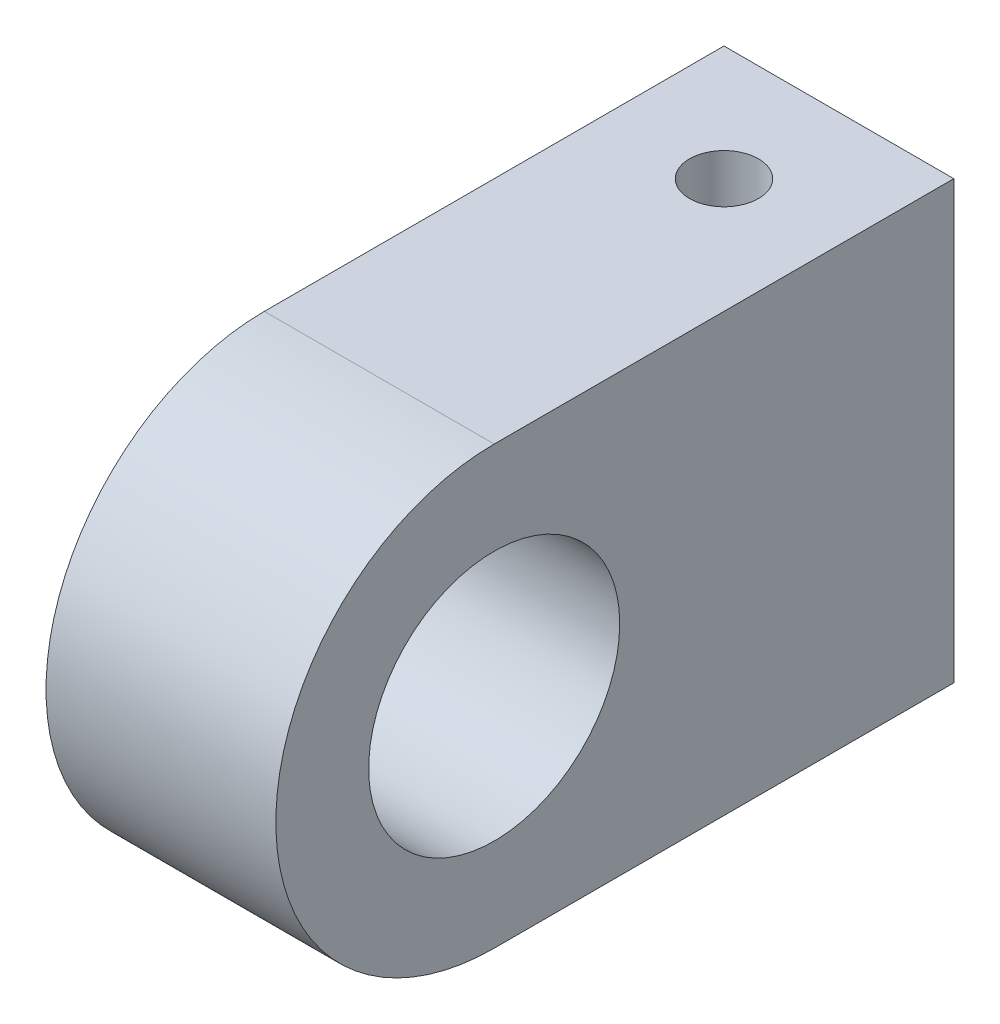
ISO-10303-21;
HEADER;
FILE_DESCRIPTION(('STEP AP214'),'2;1');
FILE_NAME('part.step','',(''),(''),'','','');
FILE_SCHEMA(('AUTOMOTIVE_DESIGN { 1 0 10303 214 1 1 1 1 }'));
ENDSEC;
DATA;
#1=APPLICATION_CONTEXT('core data for automotive mechanical design processes');
#2=APPLICATION_PROTOCOL_DEFINITION('international standard','automotive_design',2000,#1);
#3=PRODUCT_CONTEXT('',#1,'mechanical');
#4=PRODUCT('Part','Part','',(#3));
#5=PRODUCT_RELATED_PRODUCT_CATEGORY('part','',(#4));
#6=PRODUCT_DEFINITION_FORMATION('','',#4);
#7=PRODUCT_DEFINITION_CONTEXT('part definition',#1,'design');
#8=PRODUCT_DEFINITION('design','',#6,#7);
#9=PRODUCT_DEFINITION_SHAPE('','',#8);
#10=(LENGTH_UNIT() NAMED_UNIT(*) SI_UNIT(.MILLI.,.METRE.));
#11=(NAMED_UNIT(*) PLANE_ANGLE_UNIT() SI_UNIT($,.RADIAN.));
#12=(NAMED_UNIT(*) SI_UNIT($,.STERADIAN.) SOLID_ANGLE_UNIT());
#13=UNCERTAINTY_MEASURE_WITH_UNIT(LENGTH_MEASURE(1.E-05),#10,'distance_accuracy_value','');
#14=(GEOMETRIC_REPRESENTATION_CONTEXT(3) GLOBAL_UNCERTAINTY_ASSIGNED_CONTEXT((#13)) GLOBAL_UNIT_ASSIGNED_CONTEXT((#10,
#11,#12)) REPRESENTATION_CONTEXT('',''));
#15=CARTESIAN_POINT('',(0.,0.,0.));
#16=DIRECTION('',(0.,0.,1.));
#17=DIRECTION('',(1.,0.,0.));
#18=AXIS2_PLACEMENT_3D('',#15,#16,#17);
#19=CARTESIAN_POINT('',(10.,0.,0.));
#20=DIRECTION('',(1.,0.,0.));
#21=DIRECTION('',(0.,0.,-1.));
#22=AXIS2_PLACEMENT_3D('',#19,#20,#21);
#23=PLANE('',#22);
#24=CARTESIAN_POINT('',(10.,0.,0.));
#25=DIRECTION('',(1.,0.,0.));
#26=DIRECTION('',(0.,0.,-1.));
#27=AXIS2_PLACEMENT_3D('',#24,#25,#26);
#28=CIRCLE('',#27,9.5);
#29=CARTESIAN_POINT('',(10.,9.5,0.));
#30=VERTEX_POINT('',#29);
#31=CARTESIAN_POINT('',(10.,-9.5,0.));
#32=VERTEX_POINT('',#31);
#33=EDGE_CURVE('E52',#30,#32,#28,.T.);
#34=ORIENTED_EDGE('',*,*,#33,.T.);
#35=DIRECTION('',(0.,0.,-1.));
#36=VECTOR('',#35,1.);
#37=CARTESIAN_POINT('',(10.,-9.5,-20.));
#38=LINE('',#37,#36);
#39=CARTESIAN_POINT('',(10.,-9.5,-20.));
#40=VERTEX_POINT('',#39);
#41=EDGE_CURVE('E83',#32,#40,#38,.T.);
#42=ORIENTED_EDGE('',*,*,#41,.T.);
#43=DIRECTION('',(0.,1.,0.));
#44=VECTOR('',#43,1.);
#45=CARTESIAN_POINT('',(10.,9.5,-20.));
#46=LINE('',#45,#44);
#47=CARTESIAN_POINT('',(10.,9.5,-20.));
#48=VERTEX_POINT('',#47);
#49=EDGE_CURVE('E87',#40,#48,#46,.T.);
#50=ORIENTED_EDGE('',*,*,#49,.T.);
#51=DIRECTION('',(0.,0.,1.));
#52=VECTOR('',#51,1.);
#53=CARTESIAN_POINT('',(10.,9.5,0.));
#54=LINE('',#53,#52);
#55=EDGE_CURVE('E94',#48,#30,#54,.T.);
#56=ORIENTED_EDGE('',*,*,#55,.T.);
#57=EDGE_LOOP('',(#34,#42,#50,#56));
#58=FACE_BOUND('',#57,.T.);
#59=CARTESIAN_POINT('',(10.,0.,0.));
#60=DIRECTION('',(1.,0.,0.));
#61=DIRECTION('',(0.,0.,-1.));
#62=AXIS2_PLACEMENT_3D('',#59,#60,#61);
#63=CIRCLE('',#62,5.46283639494344);
#64=CARTESIAN_POINT('',(10.,0.,-5.46283639494344));
#65=VERTEX_POINT('',#64);
#66=EDGE_CURVE('E101',#65,#65,#63,.T.);
#67=ORIENTED_EDGE('',*,*,#66,.F.);
#68=EDGE_LOOP('',(#67));
#69=FACE_BOUND('',#68,.T.);
#70=ADVANCED_FACE('F35',(#58,#69),#23,.T.);
#71=CARTESIAN_POINT('',(0.,0.,0.));
#72=DIRECTION('',(1.,0.,0.));
#73=DIRECTION('',(0.,0.,-1.));
#74=AXIS2_PLACEMENT_3D('',#71,#72,#73);
#75=PLANE('',#74);
#76=DIRECTION('',(0.,0.,-1.));
#77=VECTOR('',#76,1.);
#78=CARTESIAN_POINT('',(0.,-9.5,-20.));
#79=LINE('',#78,#77);
#80=CARTESIAN_POINT('',(0.,-9.5,0.));
#81=VERTEX_POINT('',#80);
#82=CARTESIAN_POINT('',(0.,-9.5,-20.));
#83=VERTEX_POINT('',#82);
#84=EDGE_CURVE('E90',#81,#83,#79,.T.);
#85=ORIENTED_EDGE('',*,*,#84,.F.);
#86=CARTESIAN_POINT('',(0.,0.,0.));
#87=DIRECTION('',(1.,0.,0.));
#88=DIRECTION('',(0.,0.,1.));
#89=AXIS2_PLACEMENT_3D('',#86,#87,#88);
#90=CIRCLE('',#89,9.5);
#91=CARTESIAN_POINT('',(0.,9.5,0.));
#92=VERTEX_POINT('',#91);
#93=EDGE_CURVE('E104',#92,#81,#90,.T.);
#94=ORIENTED_EDGE('',*,*,#93,.F.);
#95=DIRECTION('',(0.,0.,1.));
#96=VECTOR('',#95,1.);
#97=CARTESIAN_POINT('',(0.,9.5,0.));
#98=LINE('',#97,#96);
#99=CARTESIAN_POINT('',(0.,9.5,-20.));
#100=VERTEX_POINT('',#99);
#101=EDGE_CURVE('E77',#100,#92,#98,.T.);
#102=ORIENTED_EDGE('',*,*,#101,.F.);
#103=DIRECTION('',(0.,1.,0.));
#104=VECTOR('',#103,1.);
#105=CARTESIAN_POINT('',(0.,9.5,-20.));
#106=LINE('',#105,#104);
#107=EDGE_CURVE('E70',#83,#100,#106,.T.);
#108=ORIENTED_EDGE('',*,*,#107,.F.);
#109=EDGE_LOOP('',(#85,#94,#102,#108));
#110=FACE_BOUND('',#109,.T.);
#111=CARTESIAN_POINT('',(0.,0.,0.));
#112=DIRECTION('',(1.,0.,0.));
#113=DIRECTION('',(0.,0.,-1.));
#114=AXIS2_PLACEMENT_3D('',#111,#112,#113);
#115=CIRCLE('',#114,5.46283639494344);
#116=CARTESIAN_POINT('',(0.,0.,-5.46283639494344));
#117=VERTEX_POINT('',#116);
#118=EDGE_CURVE('E144',#117,#117,#115,.T.);
#119=ORIENTED_EDGE('',*,*,#118,.T.);
#120=EDGE_LOOP('',(#119));
#121=FACE_BOUND('',#120,.T.);
#122=ADVANCED_FACE('F110',(#110,#121),#75,.F.);
#123=CARTESIAN_POINT('',(10.,-9.5,-20.));
#124=DIRECTION('',(0.,1.,0.));
#125=DIRECTION('',(0.,0.,1.));
#126=AXIS2_PLACEMENT_3D('',#123,#124,#125);
#127=PLANE('',#126);
#128=CARTESIAN_POINT('',(5.,-9.5,-15.));
#129=DIRECTION('',(0.,1.,0.));
#130=DIRECTION('',(0.,0.,1.));
#131=AXIS2_PLACEMENT_3D('',#128,#129,#130);
#132=CIRCLE('',#131,1.5);
#133=CARTESIAN_POINT('',(5.,-9.5,-13.5));
#134=VERTEX_POINT('',#133);
#135=EDGE_CURVE('E139',#134,#134,#132,.T.);
#136=ORIENTED_EDGE('',*,*,#135,.T.);
#137=EDGE_LOOP('',(#136));
#138=FACE_BOUND('',#137,.T.);
#139=ORIENTED_EDGE('',*,*,#84,.T.);
#140=DIRECTION('',(-1.,0.,0.));
#141=VECTOR('',#140,1.);
#142=CARTESIAN_POINT('',(10.,-9.5,-20.));
#143=LINE('',#142,#141);
#144=EDGE_CURVE('E44',#40,#83,#143,.T.);
#145=ORIENTED_EDGE('',*,*,#144,.F.);
#146=ORIENTED_EDGE('',*,*,#41,.F.);
#147=DIRECTION('',(-1.,0.,0.));
#148=VECTOR('',#147,1.);
#149=CARTESIAN_POINT('',(10.,-9.5,0.));
#150=LINE('',#149,#148);
#151=EDGE_CURVE('E11',#32,#81,#150,.T.);
#152=ORIENTED_EDGE('',*,*,#151,.T.);
#153=EDGE_LOOP('',(#139,#145,#146,#152));
#154=FACE_BOUND('',#153,.T.);
#155=ADVANCED_FACE('F37',(#138,#154),#127,.F.);
#156=CARTESIAN_POINT('',(10.,9.5,-20.));
#157=DIRECTION('',(0.,0.,1.));
#158=DIRECTION('',(0.,-1.,0.));
#159=AXIS2_PLACEMENT_3D('',#156,#157,#158);
#160=PLANE('',#159);
#161=ORIENTED_EDGE('',*,*,#107,.T.);
#162=DIRECTION('',(-1.,0.,0.));
#163=VECTOR('',#162,1.);
#164=CARTESIAN_POINT('',(10.,9.5,-20.));
#165=LINE('',#164,#163);
#166=EDGE_CURVE('E91',#48,#100,#165,.T.);
#167=ORIENTED_EDGE('',*,*,#166,.F.);
#168=ORIENTED_EDGE('',*,*,#49,.F.);
#169=ORIENTED_EDGE('',*,*,#144,.T.);
#170=EDGE_LOOP('',(#161,#167,#168,#169));
#171=FACE_BOUND('',#170,.T.);
#172=ADVANCED_FACE('F92',(#171),#160,.F.);
#173=CARTESIAN_POINT('',(10.,9.5,0.));
#174=DIRECTION('',(0.,-1.,0.));
#175=DIRECTION('',(0.,0.,-1.));
#176=AXIS2_PLACEMENT_3D('',#173,#174,#175);
#177=PLANE('',#176);
#178=CARTESIAN_POINT('',(5.,9.5,-15.));
#179=DIRECTION('',(0.,1.,0.));
#180=DIRECTION('',(0.,0.,1.));
#181=AXIS2_PLACEMENT_3D('',#178,#179,#180);
#182=CIRCLE('',#181,1.5);
#183=CARTESIAN_POINT('',(5.,9.5,-13.5));
#184=VERTEX_POINT('',#183);
#185=EDGE_CURVE('E142',#184,#184,#182,.T.);
#186=ORIENTED_EDGE('',*,*,#185,.F.);
#187=EDGE_LOOP('',(#186));
#188=FACE_BOUND('',#187,.T.);
#189=ORIENTED_EDGE('',*,*,#101,.T.);
#190=DIRECTION('',(-1.,0.,0.));
#191=VECTOR('',#190,1.);
#192=CARTESIAN_POINT('',(10.,9.5,0.));
#193=LINE('',#192,#191);
#194=EDGE_CURVE('E96',#30,#92,#193,.T.);
#195=ORIENTED_EDGE('',*,*,#194,.F.);
#196=ORIENTED_EDGE('',*,*,#55,.F.);
#197=ORIENTED_EDGE('',*,*,#166,.T.);
#198=EDGE_LOOP('',(#189,#195,#196,#197));
#199=FACE_BOUND('',#198,.T.);
#200=ADVANCED_FACE('F107',(#188,#199),#177,.F.);
#201=CARTESIAN_POINT('',(10.,0.,0.));
#202=DIRECTION('',(-1.,0.,0.));
#203=DIRECTION('',(0.,0.,1.));
#204=AXIS2_PLACEMENT_3D('',#201,#202,#203);
#205=CYLINDRICAL_SURFACE('',#204,9.5);
#206=ORIENTED_EDGE('',*,*,#93,.T.);
#207=ORIENTED_EDGE('',*,*,#151,.F.);
#208=ORIENTED_EDGE('',*,*,#33,.F.);
#209=ORIENTED_EDGE('',*,*,#194,.T.);
#210=EDGE_LOOP('',(#206,#207,#208,#209));
#211=FACE_BOUND('',#210,.T.);
#212=ADVANCED_FACE('F112',(#211),#205,.T.);
#213=CARTESIAN_POINT('',(10.,0.,0.));
#214=DIRECTION('',(-1.,0.,0.));
#215=DIRECTION('',(0.,0.,1.));
#216=AXIS2_PLACEMENT_3D('',#213,#214,#215);
#217=CYLINDRICAL_SURFACE('',#216,5.46283639494344);
#218=ORIENTED_EDGE('',*,*,#66,.T.);
#219=EDGE_LOOP('',(#218));
#220=FACE_BOUND('',#219,.T.);
#221=ORIENTED_EDGE('',*,*,#118,.F.);
#222=EDGE_LOOP('',(#221));
#223=FACE_BOUND('',#222,.T.);
#224=ADVANCED_FACE('F114',(#220,#223),#217,.F.);
#225=CARTESIAN_POINT('',(5.,-9.5,-15.));
#226=DIRECTION('',(0.,1.,0.));
#227=DIRECTION('',(0.,0.,1.));
#228=AXIS2_PLACEMENT_3D('',#225,#226,#227);
#229=CYLINDRICAL_SURFACE('',#228,1.5);
#230=ORIENTED_EDGE('',*,*,#135,.F.);
#231=EDGE_LOOP('',(#230));
#232=FACE_BOUND('',#231,.T.);
#233=ORIENTED_EDGE('',*,*,#185,.T.);
#234=EDGE_LOOP('',(#233));
#235=FACE_BOUND('',#234,.T.);
#236=ADVANCED_FACE('F120',(#232,#235),#229,.F.);
#237=CLOSED_SHELL('',(#70,#122,#155,#172,#200,#212,#224,#236));
#238=MANIFOLD_SOLID_BREP('B2',#237);
#239=ADVANCED_BREP_SHAPE_REPRESENTATION('',(#18,#238),#14);
#240=SHAPE_DEFINITION_REPRESENTATION(#9,#239);
ENDSEC;
END-ISO-10303-21;
